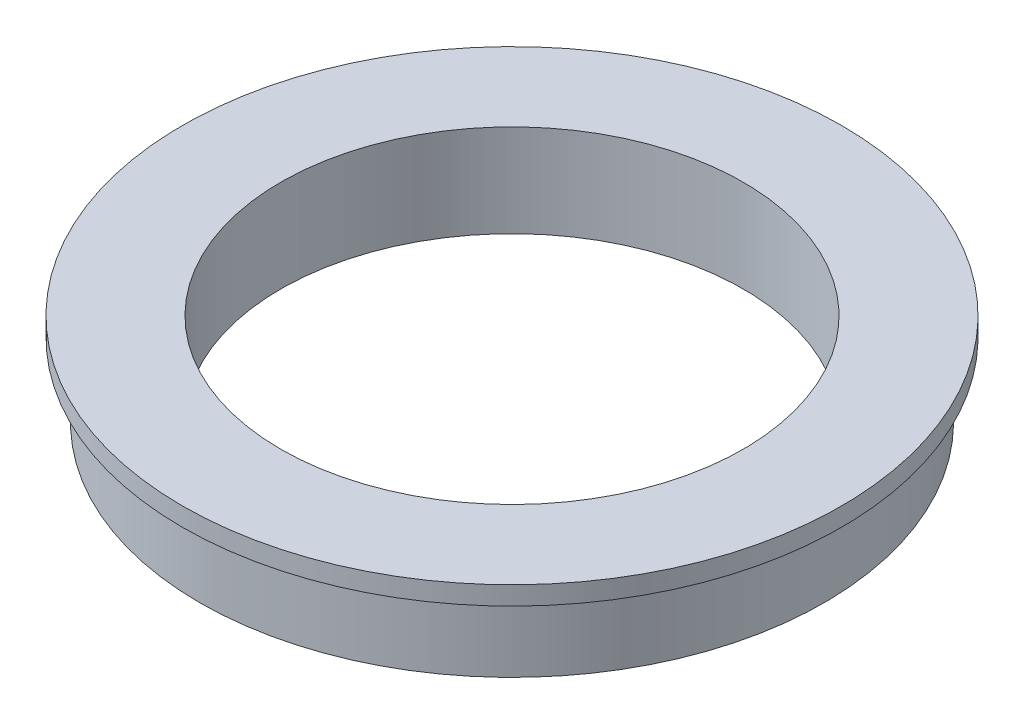
ISO-10303-21;
HEADER;
FILE_DESCRIPTION(('STEP AP214'),'2;1');
FILE_NAME('part.step','',(''),(''),'','','');
FILE_SCHEMA(('AUTOMOTIVE_DESIGN { 1 0 10303 214 1 1 1 1 }'));
ENDSEC;
DATA;
#1=APPLICATION_CONTEXT('core data for automotive mechanical design processes');
#2=APPLICATION_PROTOCOL_DEFINITION('international standard','automotive_design',2000,#1);
#3=PRODUCT_CONTEXT('',#1,'mechanical');
#4=PRODUCT('Part','Part','',(#3));
#5=PRODUCT_RELATED_PRODUCT_CATEGORY('part','',(#4));
#6=PRODUCT_DEFINITION_FORMATION('','',#4);
#7=PRODUCT_DEFINITION_CONTEXT('part definition',#1,'design');
#8=PRODUCT_DEFINITION('design','',#6,#7);
#9=PRODUCT_DEFINITION_SHAPE('','',#8);
#10=(LENGTH_UNIT() NAMED_UNIT(*) SI_UNIT(.MILLI.,.METRE.));
#11=(NAMED_UNIT(*) PLANE_ANGLE_UNIT() SI_UNIT($,.RADIAN.));
#12=(NAMED_UNIT(*) SI_UNIT($,.STERADIAN.) SOLID_ANGLE_UNIT());
#13=UNCERTAINTY_MEASURE_WITH_UNIT(LENGTH_MEASURE(1.E-05),#10,'distance_accuracy_value','');
#14=(GEOMETRIC_REPRESENTATION_CONTEXT(3) GLOBAL_UNCERTAINTY_ASSIGNED_CONTEXT((#13)) GLOBAL_UNIT_ASSIGNED_CONTEXT((#10,
#11,#12)) REPRESENTATION_CONTEXT('',''));
#15=CARTESIAN_POINT('',(0.,0.,0.));
#16=DIRECTION('',(0.,0.,1.));
#17=DIRECTION('',(1.,0.,0.));
#18=AXIS2_PLACEMENT_3D('',#15,#16,#17);
#19=CARTESIAN_POINT('',(0.,0.,0.));
#20=DIRECTION('',(0.,1.,0.));
#21=DIRECTION('',(0.,0.,1.));
#22=AXIS2_PLACEMENT_3D('',#19,#20,#21);
#23=PLANE('',#22);
#24=CARTESIAN_POINT('',(0.,0.,0.));
#25=DIRECTION('',(0.,1.,0.));
#26=DIRECTION('',(0.,0.,1.));
#27=AXIS2_PLACEMENT_3D('',#24,#25,#26);
#28=CIRCLE('',#27,13.5);
#29=CARTESIAN_POINT('',(0.,0.,13.5));
#30=VERTEX_POINT('',#29);
#31=EDGE_CURVE('E43',#30,#30,#28,.T.);
#32=ORIENTED_EDGE('',*,*,#31,.F.);
#33=EDGE_LOOP('',(#32));
#34=FACE_BOUND('',#33,.T.);
#35=CARTESIAN_POINT('',(0.,0.,0.));
#36=DIRECTION('',(0.,1.,0.));
#37=DIRECTION('',(0.,0.,1.));
#38=AXIS2_PLACEMENT_3D('',#35,#36,#37);
#39=CIRCLE('',#38,10.);
#40=CARTESIAN_POINT('',(0.,0.,10.));
#41=VERTEX_POINT('',#40);
#42=EDGE_CURVE('E50',#41,#41,#39,.T.);
#43=ORIENTED_EDGE('',*,*,#42,.T.);
#44=EDGE_LOOP('',(#43));
#45=FACE_BOUND('',#44,.T.);
#46=ADVANCED_FACE('F39',(#34,#45),#23,.F.);
#47=CARTESIAN_POINT('',(0.,3.2,0.));
#48=DIRECTION('',(0.,-1.,0.));
#49=DIRECTION('',(0.,0.,-1.));
#50=AXIS2_PLACEMENT_3D('',#47,#48,#49);
#51=CYLINDRICAL_SURFACE('',#50,13.5);
#52=CARTESIAN_POINT('',(0.,3.2,0.));
#53=DIRECTION('',(0.,1.,0.));
#54=DIRECTION('',(0.,0.,1.));
#55=AXIS2_PLACEMENT_3D('',#52,#53,#54);
#56=CIRCLE('',#55,13.5);
#57=CARTESIAN_POINT('',(0.,3.2,13.5));
#58=VERTEX_POINT('',#57);
#59=EDGE_CURVE('E10',#58,#58,#56,.T.);
#60=ORIENTED_EDGE('',*,*,#59,.F.);
#61=EDGE_LOOP('',(#60));
#62=FACE_BOUND('',#61,.T.);
#63=ORIENTED_EDGE('',*,*,#31,.T.);
#64=EDGE_LOOP('',(#63));
#65=FACE_BOUND('',#64,.T.);
#66=ADVANCED_FACE('F41',(#62,#65),#51,.T.);
#67=CARTESIAN_POINT('',(0.,3.2,0.));
#68=DIRECTION('',(0.,-1.,0.));
#69=DIRECTION('',(0.,0.,-1.));
#70=AXIS2_PLACEMENT_3D('',#67,#68,#69);
#71=CYLINDRICAL_SURFACE('',#70,10.);
#72=ORIENTED_EDGE('',*,*,#42,.F.);
#73=EDGE_LOOP('',(#72));
#74=FACE_BOUND('',#73,.T.);
#75=CARTESIAN_POINT('',(0.,4.,0.));
#76=DIRECTION('',(0.,1.,0.));
#77=DIRECTION('',(0.,0.,1.));
#78=AXIS2_PLACEMENT_3D('',#75,#76,#77);
#79=CIRCLE('',#78,10.);
#80=CARTESIAN_POINT('',(0.,4.,10.));
#81=VERTEX_POINT('',#80);
#82=EDGE_CURVE('E58',#81,#81,#79,.T.);
#83=ORIENTED_EDGE('',*,*,#82,.T.);
#84=EDGE_LOOP('',(#83));
#85=FACE_BOUND('',#84,.T.);
#86=ADVANCED_FACE('F64',(#74,#85),#71,.F.);
#87=CARTESIAN_POINT('',(0.,4.,0.));
#88=DIRECTION('',(0.,1.,0.));
#89=DIRECTION('',(0.,0.,1.));
#90=AXIS2_PLACEMENT_3D('',#87,#88,#89);
#91=PLANE('',#90);
#92=CARTESIAN_POINT('',(0.,4.,0.));
#93=DIRECTION('',(0.,1.,0.));
#94=DIRECTION('',(0.,0.,1.));
#95=AXIS2_PLACEMENT_3D('',#92,#93,#94);
#96=CIRCLE('',#95,14.25);
#97=CARTESIAN_POINT('',(0.,4.,14.25));
#98=VERTEX_POINT('',#97);
#99=EDGE_CURVE('E54',#98,#98,#96,.T.);
#100=ORIENTED_EDGE('',*,*,#99,.T.);
#101=EDGE_LOOP('',(#100));
#102=FACE_BOUND('',#101,.T.);
#103=ORIENTED_EDGE('',*,*,#82,.F.);
#104=EDGE_LOOP('',(#103));
#105=FACE_BOUND('',#104,.T.);
#106=ADVANCED_FACE('F66',(#102,#105),#91,.T.);
#107=CARTESIAN_POINT('',(0.,3.2,0.));
#108=DIRECTION('',(0.,1.,0.));
#109=DIRECTION('',(0.,0.,1.));
#110=AXIS2_PLACEMENT_3D('',#107,#108,#109);
#111=PLANE('',#110);
#112=ORIENTED_EDGE('',*,*,#59,.T.);
#113=EDGE_LOOP('',(#112));
#114=FACE_BOUND('',#113,.T.);
#115=CARTESIAN_POINT('',(0.,3.2,0.));
#116=DIRECTION('',(0.,1.,0.));
#117=DIRECTION('',(0.,0.,1.));
#118=AXIS2_PLACEMENT_3D('',#115,#116,#117);
#119=CIRCLE('',#118,14.25);
#120=CARTESIAN_POINT('',(0.,3.2,14.25));
#121=VERTEX_POINT('',#120);
#122=EDGE_CURVE('E55',#121,#121,#119,.T.);
#123=ORIENTED_EDGE('',*,*,#122,.F.);
#124=EDGE_LOOP('',(#123));
#125=FACE_BOUND('',#124,.T.);
#126=ADVANCED_FACE('F68',(#114,#125),#111,.F.);
#127=CARTESIAN_POINT('',(0.,4.,0.));
#128=DIRECTION('',(0.,-1.,0.));
#129=DIRECTION('',(0.,0.,-1.));
#130=AXIS2_PLACEMENT_3D('',#127,#128,#129);
#131=CYLINDRICAL_SURFACE('',#130,14.25);
#132=ORIENTED_EDGE('',*,*,#99,.F.);
#133=EDGE_LOOP('',(#132));
#134=FACE_BOUND('',#133,.T.);
#135=ORIENTED_EDGE('',*,*,#122,.T.);
#136=EDGE_LOOP('',(#135));
#137=FACE_BOUND('',#136,.T.);
#138=ADVANCED_FACE('F75',(#134,#137),#131,.T.);
#139=CLOSED_SHELL('',(#46,#66,#86,#106,#126,#138));
#140=MANIFOLD_SOLID_BREP('B2',#139);
#141=ADVANCED_BREP_SHAPE_REPRESENTATION('',(#18,#140),#14);
#142=SHAPE_DEFINITION_REPRESENTATION(#9,#141);
ENDSEC;
END-ISO-10303-21;
